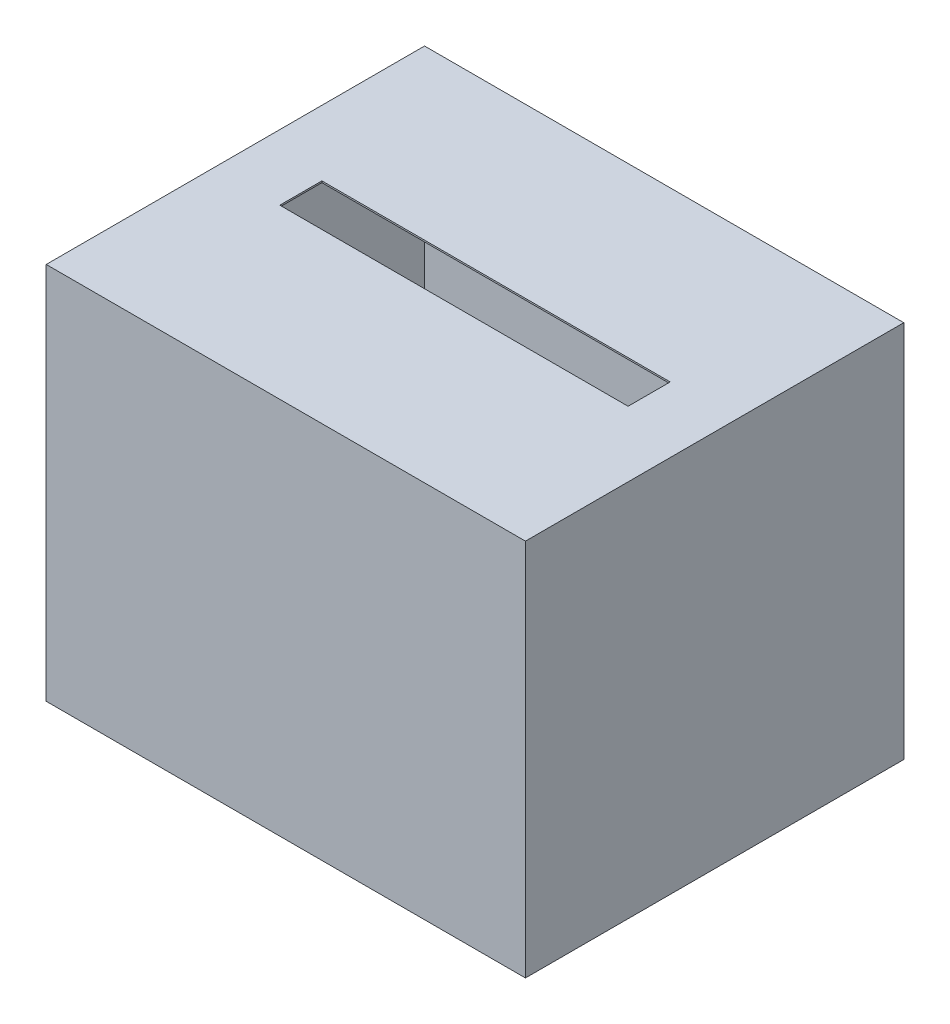
ISO-10303-21;
HEADER;
FILE_DESCRIPTION(('STEP AP214'),'2;1');
FILE_NAME('part.step','',(''),(''),'','','');
FILE_SCHEMA(('AUTOMOTIVE_DESIGN { 1 0 10303 214 1 1 1 1 }'));
ENDSEC;
DATA;
#1=APPLICATION_CONTEXT('core data for automotive mechanical design processes');
#2=APPLICATION_PROTOCOL_DEFINITION('international standard','automotive_design',2000,#1);
#3=PRODUCT_CONTEXT('',#1,'mechanical');
#4=PRODUCT('Part','Part','',(#3));
#5=PRODUCT_RELATED_PRODUCT_CATEGORY('part','',(#4));
#6=PRODUCT_DEFINITION_FORMATION('','',#4);
#7=PRODUCT_DEFINITION_CONTEXT('part definition',#1,'design');
#8=PRODUCT_DEFINITION('design','',#6,#7);
#9=PRODUCT_DEFINITION_SHAPE('','',#8);
#10=(LENGTH_UNIT() NAMED_UNIT(*) SI_UNIT(.MILLI.,.METRE.));
#11=(NAMED_UNIT(*) PLANE_ANGLE_UNIT() SI_UNIT($,.RADIAN.));
#12=(NAMED_UNIT(*) SI_UNIT($,.STERADIAN.) SOLID_ANGLE_UNIT());
#13=UNCERTAINTY_MEASURE_WITH_UNIT(LENGTH_MEASURE(1.E-05),#10,'distance_accuracy_value','');
#14=(GEOMETRIC_REPRESENTATION_CONTEXT(3) GLOBAL_UNCERTAINTY_ASSIGNED_CONTEXT((#13)) GLOBAL_UNIT_ASSIGNED_CONTEXT((#10,
#11,#12)) REPRESENTATION_CONTEXT('',''));
#15=CARTESIAN_POINT('',(0.,0.,0.));
#16=DIRECTION('',(0.,0.,1.));
#17=DIRECTION('',(1.,0.,0.));
#18=AXIS2_PLACEMENT_3D('',#15,#16,#17);
#19=CARTESIAN_POINT('',(0.,762.,381.));
#20=DIRECTION('',(0.,-1.,0.));
#21=DIRECTION('',(0.,0.,-1.));
#22=AXIS2_PLACEMENT_3D('',#19,#20,#21);
#23=PLANE('',#22);
#24=DIRECTION('',(-1.,0.,0.));
#25=VECTOR('',#24,1.);
#26=CARTESIAN_POINT('',(0.,762.,-381.));
#27=LINE('',#26,#25);
#28=CARTESIAN_POINT('',(965.2,762.,-381.));
#29=VERTEX_POINT('',#28);
#30=CARTESIAN_POINT('',(0.,762.,-381.));
#31=VERTEX_POINT('',#30);
#32=EDGE_CURVE('E193',#29,#31,#27,.T.);
#33=ORIENTED_EDGE('',*,*,#32,.T.);
#34=DIRECTION('',(0.,0.,-1.));
#35=VECTOR('',#34,1.);
#36=CARTESIAN_POINT('',(0.,762.,381.));
#37=LINE('',#36,#35);
#38=CARTESIAN_POINT('',(0.,762.,381.));
#39=VERTEX_POINT('',#38);
#40=EDGE_CURVE('E199',#39,#31,#37,.T.);
#41=ORIENTED_EDGE('',*,*,#40,.F.);
#42=DIRECTION('',(-1.,0.,0.));
#43=VECTOR('',#42,1.);
#44=CARTESIAN_POINT('',(0.,762.,381.));
#45=LINE('',#44,#43);
#46=CARTESIAN_POINT('',(965.2,762.,381.));
#47=VERTEX_POINT('',#46);
#48=EDGE_CURVE('E197',#47,#39,#45,.T.);
#49=ORIENTED_EDGE('',*,*,#48,.F.);
#50=DIRECTION('',(0.,0.,-1.));
#51=VECTOR('',#50,1.);
#52=CARTESIAN_POINT('',(965.2,762.,381.));
#53=LINE('',#52,#51);
#54=EDGE_CURVE('E208',#47,#29,#53,.T.);
#55=ORIENTED_EDGE('',*,*,#54,.T.);
#56=EDGE_LOOP('',(#33,#41,#49,#55));
#57=FACE_BOUND('',#56,.T.);
#58=DIRECTION('',(0.,0.,1.));
#59=VECTOR('',#58,1.);
#60=CARTESIAN_POINT('',(131.864130630888,762.,42.4133081073457));
#61=LINE('',#60,#59);
#62=CARTESIAN_POINT('',(131.864130630888,762.,-42.4133081073457));
#63=VERTEX_POINT('',#62);
#64=CARTESIAN_POINT('',(131.864130630888,762.,42.4133081073457));
#65=VERTEX_POINT('',#64);
#66=EDGE_CURVE('E131',#63,#65,#61,.T.);
#67=ORIENTED_EDGE('',*,*,#66,.F.);
#68=DIRECTION('',(-1.,0.,0.));
#69=VECTOR('',#68,1.);
#70=CARTESIAN_POINT('',(833.335869369112,762.,-42.4133081073457));
#71=LINE('',#70,#69);
#72=CARTESIAN_POINT('',(833.335869369112,762.,-42.4133081073457));
#73=VERTEX_POINT('',#72);
#74=EDGE_CURVE('E148',#73,#63,#71,.T.);
#75=ORIENTED_EDGE('',*,*,#74,.F.);
#76=DIRECTION('',(0.,0.,-1.));
#77=VECTOR('',#76,1.);
#78=CARTESIAN_POINT('',(833.335869369112,762.,42.4133081073457));
#79=LINE('',#78,#77);
#80=CARTESIAN_POINT('',(833.335869369112,762.,42.4133081073457));
#81=VERTEX_POINT('',#80);
#82=EDGE_CURVE('E151',#81,#73,#79,.T.);
#83=ORIENTED_EDGE('',*,*,#82,.F.);
#84=DIRECTION('',(1.,0.,0.));
#85=VECTOR('',#84,1.);
#86=CARTESIAN_POINT('',(833.335869369112,762.,42.4133081073457));
#87=LINE('',#86,#85);
#88=EDGE_CURVE('E157',#65,#81,#87,.T.);
#89=ORIENTED_EDGE('',*,*,#88,.F.);
#90=EDGE_LOOP('',(#67,#75,#83,#89));
#91=FACE_BOUND('',#90,.T.);
#92=ADVANCED_FACE('F33',(#57,#91),#23,.F.);
#93=CARTESIAN_POINT('',(0.,0.,381.));
#94=DIRECTION('',(1.,0.,0.));
#95=DIRECTION('',(0.,1.,0.));
#96=AXIS2_PLACEMENT_3D('',#93,#94,#95);
#97=PLANE('',#96);
#98=DIRECTION('',(0.,-1.,0.));
#99=VECTOR('',#98,1.);
#100=CARTESIAN_POINT('',(0.,0.,-381.));
#101=LINE('',#100,#99);
#102=CARTESIAN_POINT('',(0.,0.,-381.));
#103=VERTEX_POINT('',#102);
#104=EDGE_CURVE('E177',#31,#103,#101,.T.);
#105=ORIENTED_EDGE('',*,*,#104,.T.);
#106=DIRECTION('',(0.,0.,-1.));
#107=VECTOR('',#106,1.);
#108=CARTESIAN_POINT('',(0.,0.,381.));
#109=LINE('',#108,#107);
#110=CARTESIAN_POINT('',(0.,0.,381.));
#111=VERTEX_POINT('',#110);
#112=EDGE_CURVE('E41',#111,#103,#109,.T.);
#113=ORIENTED_EDGE('',*,*,#112,.F.);
#114=DIRECTION('',(0.,-1.,0.));
#115=VECTOR('',#114,1.);
#116=CARTESIAN_POINT('',(0.,0.,381.));
#117=LINE('',#116,#115);
#118=EDGE_CURVE('E190',#39,#111,#117,.T.);
#119=ORIENTED_EDGE('',*,*,#118,.F.);
#120=ORIENTED_EDGE('',*,*,#40,.T.);
#121=EDGE_LOOP('',(#105,#113,#119,#120));
#122=FACE_BOUND('',#121,.T.);
#123=ADVANCED_FACE('F35',(#122),#97,.F.);
#124=CARTESIAN_POINT('',(0.,0.,381.));
#125=DIRECTION('',(0.,1.,0.));
#126=DIRECTION('',(-1.,0.,0.));
#127=AXIS2_PLACEMENT_3D('',#124,#125,#126);
#128=PLANE('',#127);
#129=DIRECTION('',(1.,0.,0.));
#130=VECTOR('',#129,1.);
#131=CARTESIAN_POINT('',(0.,0.,-381.));
#132=LINE('',#131,#130);
#133=CARTESIAN_POINT('',(965.2,0.,-381.));
#134=VERTEX_POINT('',#133);
#135=EDGE_CURVE('E201',#103,#134,#132,.T.);
#136=ORIENTED_EDGE('',*,*,#135,.T.);
#137=DIRECTION('',(0.,0.,-1.));
#138=VECTOR('',#137,1.);
#139=CARTESIAN_POINT('',(965.2,0.,381.));
#140=LINE('',#139,#138);
#141=CARTESIAN_POINT('',(965.2,0.,381.));
#142=VERTEX_POINT('',#141);
#143=EDGE_CURVE('E211',#142,#134,#140,.T.);
#144=ORIENTED_EDGE('',*,*,#143,.F.);
#145=DIRECTION('',(1.,0.,0.));
#146=VECTOR('',#145,1.);
#147=CARTESIAN_POINT('',(0.,0.,381.));
#148=LINE('',#147,#146);
#149=EDGE_CURVE('E192',#111,#142,#148,.T.);
#150=ORIENTED_EDGE('',*,*,#149,.F.);
#151=ORIENTED_EDGE('',*,*,#112,.T.);
#152=EDGE_LOOP('',(#136,#144,#150,#151));
#153=FACE_BOUND('',#152,.T.);
#154=ADVANCED_FACE('F217',(#153),#128,.F.);
#155=CARTESIAN_POINT('',(965.2,0.,381.));
#156=DIRECTION('',(-1.,0.,0.));
#157=DIRECTION('',(0.,0.,1.));
#158=AXIS2_PLACEMENT_3D('',#155,#156,#157);
#159=PLANE('',#158);
#160=ORIENTED_EDGE('',*,*,#54,.F.);
#161=DIRECTION('',(0.,1.,0.));
#162=VECTOR('',#161,1.);
#163=CARTESIAN_POINT('',(965.2,0.,381.));
#164=LINE('',#163,#162);
#165=EDGE_CURVE('E195',#142,#47,#164,.T.);
#166=ORIENTED_EDGE('',*,*,#165,.F.);
#167=ORIENTED_EDGE('',*,*,#143,.T.);
#168=DIRECTION('',(0.,1.,0.));
#169=VECTOR('',#168,1.);
#170=CARTESIAN_POINT('',(965.2,0.,-381.));
#171=LINE('',#170,#169);
#172=EDGE_CURVE('E203',#134,#29,#171,.T.);
#173=ORIENTED_EDGE('',*,*,#172,.T.);
#174=EDGE_LOOP('',(#160,#166,#167,#173));
#175=FACE_BOUND('',#174,.T.);
#176=ADVANCED_FACE('F230',(#175),#159,.F.);
#177=CARTESIAN_POINT('',(0.,762.,381.));
#178=DIRECTION('',(0.,0.,-1.));
#179=DIRECTION('',(-1.,0.,0.));
#180=AXIS2_PLACEMENT_3D('',#177,#178,#179);
#181=PLANE('',#180);
#182=ORIENTED_EDGE('',*,*,#118,.T.);
#183=ORIENTED_EDGE('',*,*,#149,.T.);
#184=ORIENTED_EDGE('',*,*,#165,.T.);
#185=ORIENTED_EDGE('',*,*,#48,.T.);
#186=EDGE_LOOP('',(#182,#183,#184,#185));
#187=FACE_BOUND('',#186,.T.);
#188=ADVANCED_FACE('F236',(#187),#181,.F.);
#189=CARTESIAN_POINT('',(0.,762.,-381.));
#190=DIRECTION('',(0.,0.,-1.));
#191=DIRECTION('',(-1.,0.,0.));
#192=AXIS2_PLACEMENT_3D('',#189,#190,#191);
#193=PLANE('',#192);
#194=ORIENTED_EDGE('',*,*,#32,.F.);
#195=ORIENTED_EDGE('',*,*,#172,.F.);
#196=ORIENTED_EDGE('',*,*,#135,.F.);
#197=ORIENTED_EDGE('',*,*,#104,.F.);
#198=EDGE_LOOP('',(#194,#195,#196,#197));
#199=FACE_BOUND('',#198,.T.);
#200=ADVANCED_FACE('F227',(#199),#193,.T.);
#201=CARTESIAN_POINT('',(965.2,758.825,-381.));
#202=DIRECTION('',(0.,1.,0.));
#203=DIRECTION('',(0.,0.,1.));
#204=AXIS2_PLACEMENT_3D('',#201,#202,#203);
#205=PLANE('',#204);
#206=DIRECTION('',(1.,0.,0.));
#207=VECTOR('',#206,1.);
#208=CARTESIAN_POINT('',(0.,758.825,378.46));
#209=LINE('',#208,#207);
#210=CARTESIAN_POINT('',(2.54,758.825,378.46));
#211=VERTEX_POINT('',#210);
#212=CARTESIAN_POINT('',(962.66,758.825,378.46));
#213=VERTEX_POINT('',#212);
#214=EDGE_CURVE('E48',#211,#213,#209,.T.);
#215=ORIENTED_EDGE('',*,*,#214,.F.);
#216=DIRECTION('',(0.,0.,1.));
#217=VECTOR('',#216,1.);
#218=CARTESIAN_POINT('',(2.54,758.825,381.));
#219=LINE('',#218,#217);
#220=CARTESIAN_POINT('',(2.54,758.825,-378.46));
#221=VERTEX_POINT('',#220);
#222=EDGE_CURVE('E56',#221,#211,#219,.T.);
#223=ORIENTED_EDGE('',*,*,#222,.F.);
#224=DIRECTION('',(1.,0.,0.));
#225=VECTOR('',#224,1.);
#226=CARTESIAN_POINT('',(0.,758.825,-378.46));
#227=LINE('',#226,#225);
#228=CARTESIAN_POINT('',(962.66,758.825,-378.46));
#229=VERTEX_POINT('',#228);
#230=EDGE_CURVE('E11',#221,#229,#227,.T.);
#231=ORIENTED_EDGE('',*,*,#230,.T.);
#232=DIRECTION('',(0.,0.,-1.));
#233=VECTOR('',#232,1.);
#234=CARTESIAN_POINT('',(962.66,758.825,381.));
#235=LINE('',#234,#233);
#236=EDGE_CURVE('E163',#213,#229,#235,.T.);
#237=ORIENTED_EDGE('',*,*,#236,.F.);
#238=EDGE_LOOP('',(#215,#223,#231,#237));
#239=FACE_BOUND('',#238,.T.);
#240=DIRECTION('',(-1.,0.,0.));
#241=VECTOR('',#240,1.);
#242=CARTESIAN_POINT('',(833.335869369112,758.825,-42.4133081073457));
#243=LINE('',#242,#241);
#244=CARTESIAN_POINT('',(833.335869369112,758.825,-42.4133081073457));
#245=VERTEX_POINT('',#244);
#246=CARTESIAN_POINT('',(131.864130630888,758.825,-42.4133081073457));
#247=VERTEX_POINT('',#246);
#248=EDGE_CURVE('E136',#245,#247,#243,.T.);
#249=ORIENTED_EDGE('',*,*,#248,.T.);
#250=DIRECTION('',(0.,0.,1.));
#251=VECTOR('',#250,1.);
#252=CARTESIAN_POINT('',(131.864130630888,758.825,42.4133081073457));
#253=LINE('',#252,#251);
#254=CARTESIAN_POINT('',(131.864130630888,758.825,42.4133081073457));
#255=VERTEX_POINT('',#254);
#256=EDGE_CURVE('E128',#247,#255,#253,.T.);
#257=ORIENTED_EDGE('',*,*,#256,.T.);
#258=DIRECTION('',(1.,0.,0.));
#259=VECTOR('',#258,1.);
#260=CARTESIAN_POINT('',(833.335869369112,758.825,42.4133081073457));
#261=LINE('',#260,#259);
#262=CARTESIAN_POINT('',(833.335869369112,758.825,42.4133081073457));
#263=VERTEX_POINT('',#262);
#264=EDGE_CURVE('E140',#255,#263,#261,.T.);
#265=ORIENTED_EDGE('',*,*,#264,.T.);
#266=DIRECTION('',(0.,0.,-1.));
#267=VECTOR('',#266,1.);
#268=CARTESIAN_POINT('',(833.335869369112,758.825,42.4133081073457));
#269=LINE('',#268,#267);
#270=EDGE_CURVE('E144',#263,#245,#269,.T.);
#271=ORIENTED_EDGE('',*,*,#270,.T.);
#272=EDGE_LOOP('',(#249,#257,#265,#271));
#273=FACE_BOUND('',#272,.T.);
#274=ADVANCED_FACE('F146',(#239,#273),#205,.F.);
#275=CARTESIAN_POINT('',(131.864130630888,758.825,42.4133081073457));
#276=DIRECTION('',(-1.,0.,0.));
#277=DIRECTION('',(0.,0.,1.));
#278=AXIS2_PLACEMENT_3D('',#275,#276,#277);
#279=PLANE('',#278);
#280=ORIENTED_EDGE('',*,*,#66,.T.);
#281=DIRECTION('',(0.,1.,0.));
#282=VECTOR('',#281,1.);
#283=CARTESIAN_POINT('',(131.864130630888,758.825,42.4133081073457));
#284=LINE('',#283,#282);
#285=EDGE_CURVE('E124',#255,#65,#284,.T.);
#286=ORIENTED_EDGE('',*,*,#285,.F.);
#287=ORIENTED_EDGE('',*,*,#256,.F.);
#288=DIRECTION('',(0.,1.,0.));
#289=VECTOR('',#288,1.);
#290=CARTESIAN_POINT('',(131.864130630888,758.825,-42.4133081073457));
#291=LINE('',#290,#289);
#292=EDGE_CURVE('E161',#247,#63,#291,.T.);
#293=ORIENTED_EDGE('',*,*,#292,.T.);
#294=EDGE_LOOP('',(#280,#286,#287,#293));
#295=FACE_BOUND('',#294,.T.);
#296=ADVANCED_FACE('F126',(#295),#279,.F.);
#297=CARTESIAN_POINT('',(833.335869369112,758.825,-42.4133081073457));
#298=DIRECTION('',(0.,0.,-1.));
#299=DIRECTION('',(-1.,0.,0.));
#300=AXIS2_PLACEMENT_3D('',#297,#298,#299);
#301=PLANE('',#300);
#302=ORIENTED_EDGE('',*,*,#74,.T.);
#303=ORIENTED_EDGE('',*,*,#292,.F.);
#304=ORIENTED_EDGE('',*,*,#248,.F.);
#305=DIRECTION('',(0.,1.,0.));
#306=VECTOR('',#305,1.);
#307=CARTESIAN_POINT('',(833.335869369112,758.825,-42.4133081073457));
#308=LINE('',#307,#306);
#309=EDGE_CURVE('E164',#245,#73,#308,.T.);
#310=ORIENTED_EDGE('',*,*,#309,.T.);
#311=EDGE_LOOP('',(#302,#303,#304,#310));
#312=FACE_BOUND('',#311,.T.);
#313=ADVANCED_FACE('F293',(#312),#301,.F.);
#314=CARTESIAN_POINT('',(833.335869369112,758.825,42.4133081073457));
#315=DIRECTION('',(1.,0.,0.));
#316=DIRECTION('',(0.,0.,-1.));
#317=AXIS2_PLACEMENT_3D('',#314,#315,#316);
#318=PLANE('',#317);
#319=ORIENTED_EDGE('',*,*,#82,.T.);
#320=ORIENTED_EDGE('',*,*,#309,.F.);
#321=ORIENTED_EDGE('',*,*,#270,.F.);
#322=DIRECTION('',(0.,1.,0.));
#323=VECTOR('',#322,1.);
#324=CARTESIAN_POINT('',(833.335869369112,758.825,42.4133081073457));
#325=LINE('',#324,#323);
#326=EDGE_CURVE('E135',#263,#81,#325,.T.);
#327=ORIENTED_EDGE('',*,*,#326,.T.);
#328=EDGE_LOOP('',(#319,#320,#321,#327));
#329=FACE_BOUND('',#328,.T.);
#330=ADVANCED_FACE('F302',(#329),#318,.F.);
#331=CARTESIAN_POINT('',(833.335869369112,758.825,42.4133081073457));
#332=DIRECTION('',(0.,0.,1.));
#333=DIRECTION('',(1.,0.,0.));
#334=AXIS2_PLACEMENT_3D('',#331,#332,#333);
#335=PLANE('',#334);
#336=ORIENTED_EDGE('',*,*,#88,.T.);
#337=ORIENTED_EDGE('',*,*,#326,.F.);
#338=ORIENTED_EDGE('',*,*,#264,.F.);
#339=ORIENTED_EDGE('',*,*,#285,.T.);
#340=EDGE_LOOP('',(#336,#337,#338,#339));
#341=FACE_BOUND('',#340,.T.);
#342=ADVANCED_FACE('F141',(#341),#335,.F.);
#343=CARTESIAN_POINT('',(0.,2.54,381.));
#344=DIRECTION('',(0.,1.,0.));
#345=DIRECTION('',(-1.,0.,0.));
#346=AXIS2_PLACEMENT_3D('',#343,#344,#345);
#347=PLANE('',#346);
#348=DIRECTION('',(1.,0.,0.));
#349=VECTOR('',#348,1.);
#350=CARTESIAN_POINT('',(0.,2.53999999999999,-378.46));
#351=LINE('',#350,#349);
#352=CARTESIAN_POINT('',(2.54,2.54,-378.46));
#353=VERTEX_POINT('',#352);
#354=CARTESIAN_POINT('',(962.66,2.54,-378.46));
#355=VERTEX_POINT('',#354);
#356=EDGE_CURVE('E173',#353,#355,#351,.T.);
#357=ORIENTED_EDGE('',*,*,#356,.F.);
#358=DIRECTION('',(0.,0.,-1.));
#359=VECTOR('',#358,1.);
#360=CARTESIAN_POINT('',(2.54,2.54,381.));
#361=LINE('',#360,#359);
#362=CARTESIAN_POINT('',(2.54,2.54,378.46));
#363=VERTEX_POINT('',#362);
#364=EDGE_CURVE('E174',#363,#353,#361,.T.);
#365=ORIENTED_EDGE('',*,*,#364,.F.);
#366=DIRECTION('',(1.,0.,0.));
#367=VECTOR('',#366,1.);
#368=CARTESIAN_POINT('',(0.,2.53999999999999,378.46));
#369=LINE('',#368,#367);
#370=CARTESIAN_POINT('',(962.66,2.54,378.46));
#371=VERTEX_POINT('',#370);
#372=EDGE_CURVE('E181',#363,#371,#369,.T.);
#373=ORIENTED_EDGE('',*,*,#372,.T.);
#374=DIRECTION('',(0.,0.,-1.));
#375=VECTOR('',#374,1.);
#376=CARTESIAN_POINT('',(962.66,2.54,381.));
#377=LINE('',#376,#375);
#378=EDGE_CURVE('E178',#371,#355,#377,.T.);
#379=ORIENTED_EDGE('',*,*,#378,.T.);
#380=EDGE_LOOP('',(#357,#365,#373,#379));
#381=FACE_BOUND('',#380,.T.);
#382=ADVANCED_FACE('F321',(#381),#347,.T.);
#383=CARTESIAN_POINT('',(0.,762.,-378.46));
#384=DIRECTION('',(0.,0.,-1.));
#385=DIRECTION('',(-1.,0.,0.));
#386=AXIS2_PLACEMENT_3D('',#383,#384,#385);
#387=PLANE('',#386);
#388=ORIENTED_EDGE('',*,*,#230,.F.);
#389=DIRECTION('',(0.,-1.,0.));
#390=VECTOR('',#389,1.);
#391=CARTESIAN_POINT('',(2.54,762.,-378.46));
#392=LINE('',#391,#390);
#393=EDGE_CURVE('E171',#221,#353,#392,.T.);
#394=ORIENTED_EDGE('',*,*,#393,.T.);
#395=ORIENTED_EDGE('',*,*,#356,.T.);
#396=DIRECTION('',(0.,1.,0.));
#397=VECTOR('',#396,1.);
#398=CARTESIAN_POINT('',(962.66,762.,-378.46));
#399=LINE('',#398,#397);
#400=EDGE_CURVE('E182',#355,#229,#399,.T.);
#401=ORIENTED_EDGE('',*,*,#400,.T.);
#402=EDGE_LOOP('',(#388,#394,#395,#401));
#403=FACE_BOUND('',#402,.T.);
#404=ADVANCED_FACE('F327',(#403),#387,.F.);
#405=CARTESIAN_POINT('',(0.,762.,378.46));
#406=DIRECTION('',(0.,0.,-1.));
#407=DIRECTION('',(-1.,0.,0.));
#408=AXIS2_PLACEMENT_3D('',#405,#406,#407);
#409=PLANE('',#408);
#410=DIRECTION('',(0.,-1.,0.));
#411=VECTOR('',#410,1.);
#412=CARTESIAN_POINT('',(2.54,762.,378.46));
#413=LINE('',#412,#411);
#414=EDGE_CURVE('E179',#211,#363,#413,.T.);
#415=ORIENTED_EDGE('',*,*,#414,.F.);
#416=ORIENTED_EDGE('',*,*,#214,.T.);
#417=DIRECTION('',(0.,1.,0.));
#418=VECTOR('',#417,1.);
#419=CARTESIAN_POINT('',(962.66,762.,378.46));
#420=LINE('',#419,#418);
#421=EDGE_CURVE('E186',#371,#213,#420,.T.);
#422=ORIENTED_EDGE('',*,*,#421,.F.);
#423=ORIENTED_EDGE('',*,*,#372,.F.);
#424=EDGE_LOOP('',(#415,#416,#422,#423));
#425=FACE_BOUND('',#424,.T.);
#426=ADVANCED_FACE('F332',(#425),#409,.T.);
#427=CARTESIAN_POINT('',(962.66,0.,381.));
#428=DIRECTION('',(-1.,0.,0.));
#429=DIRECTION('',(0.,0.,1.));
#430=AXIS2_PLACEMENT_3D('',#427,#428,#429);
#431=PLANE('',#430);
#432=ORIENTED_EDGE('',*,*,#421,.T.);
#433=ORIENTED_EDGE('',*,*,#236,.T.);
#434=ORIENTED_EDGE('',*,*,#400,.F.);
#435=ORIENTED_EDGE('',*,*,#378,.F.);
#436=EDGE_LOOP('',(#432,#433,#434,#435));
#437=FACE_BOUND('',#436,.T.);
#438=ADVANCED_FACE('F342',(#437),#431,.T.);
#439=CARTESIAN_POINT('',(2.54,0.,381.));
#440=DIRECTION('',(1.,0.,0.));
#441=DIRECTION('',(0.,1.,0.));
#442=AXIS2_PLACEMENT_3D('',#439,#440,#441);
#443=PLANE('',#442);
#444=ORIENTED_EDGE('',*,*,#393,.F.);
#445=ORIENTED_EDGE('',*,*,#222,.T.);
#446=ORIENTED_EDGE('',*,*,#414,.T.);
#447=ORIENTED_EDGE('',*,*,#364,.T.);
#448=EDGE_LOOP('',(#444,#445,#446,#447));
#449=FACE_BOUND('',#448,.T.);
#450=ADVANCED_FACE('F351',(#449),#443,.T.);
#451=CLOSED_SHELL('',(#92,#123,#154,#176,#188,#200,#274,#296,#313,#330,#342,#382,#404,#426,#438,#450));
#452=MANIFOLD_SOLID_BREP('B2',#451);
#453=ADVANCED_BREP_SHAPE_REPRESENTATION('',(#18,#452),#14);
#454=SHAPE_DEFINITION_REPRESENTATION(#9,#453);
ENDSEC;
END-ISO-10303-21;
